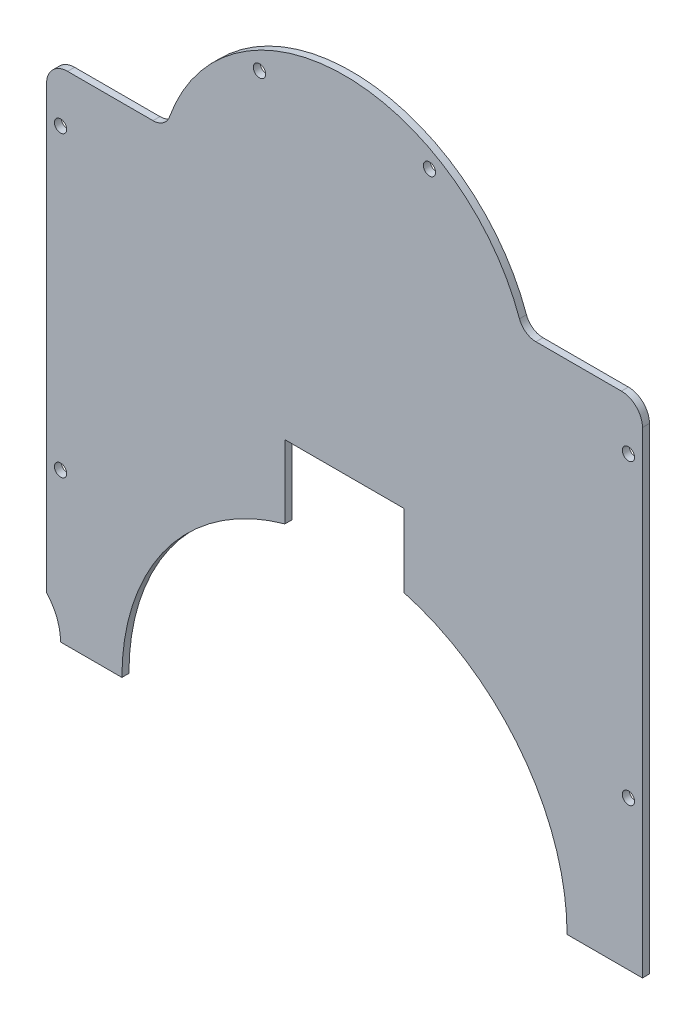
ISO-10303-21;
HEADER;
FILE_DESCRIPTION(('STEP AP214'),'2;1');
FILE_NAME('part.step','',(''),(''),'','','');
FILE_SCHEMA(('AUTOMOTIVE_DESIGN { 1 0 10303 214 1 1 1 1 }'));
ENDSEC;
DATA;
#1=APPLICATION_CONTEXT('core data for automotive mechanical design processes');
#2=APPLICATION_PROTOCOL_DEFINITION('international standard','automotive_design',2000,#1);
#3=PRODUCT_CONTEXT('',#1,'mechanical');
#4=PRODUCT('Part','Part','',(#3));
#5=PRODUCT_RELATED_PRODUCT_CATEGORY('part','',(#4));
#6=PRODUCT_DEFINITION_FORMATION('','',#4);
#7=PRODUCT_DEFINITION_CONTEXT('part definition',#1,'design');
#8=PRODUCT_DEFINITION('design','',#6,#7);
#9=PRODUCT_DEFINITION_SHAPE('','',#8);
#10=(LENGTH_UNIT() NAMED_UNIT(*) SI_UNIT(.MILLI.,.METRE.));
#11=(NAMED_UNIT(*) PLANE_ANGLE_UNIT() SI_UNIT($,.RADIAN.));
#12=(NAMED_UNIT(*) SI_UNIT($,.STERADIAN.) SOLID_ANGLE_UNIT());
#13=UNCERTAINTY_MEASURE_WITH_UNIT(LENGTH_MEASURE(1.E-05),#10,'distance_accuracy_value','');
#14=(GEOMETRIC_REPRESENTATION_CONTEXT(3) GLOBAL_UNCERTAINTY_ASSIGNED_CONTEXT((#13)) GLOBAL_UNIT_ASSIGNED_CONTEXT((#10,
#11,#12)) REPRESENTATION_CONTEXT('',''));
#15=CARTESIAN_POINT('',(0.,0.,0.));
#16=DIRECTION('',(0.,0.,1.));
#17=DIRECTION('',(1.,0.,0.));
#18=AXIS2_PLACEMENT_3D('',#15,#16,#17);
#19=CARTESIAN_POINT('',(0.,127.5,2.));
#20=DIRECTION('',(0.,0.,1.));
#21=DIRECTION('',(1.,0.,0.));
#22=AXIS2_PLACEMENT_3D('',#19,#20,#21);
#23=PLANE('',#22);
#24=CARTESIAN_POINT('',(81.,127.5,2.));
#25=DIRECTION('',(0.,0.,1.));
#26=DIRECTION('',(-1.,0.,0.));
#27=AXIS2_PLACEMENT_3D('',#24,#25,#26);
#28=CIRCLE('',#27,1.75);
#29=CARTESIAN_POINT('',(79.25,127.5,2.));
#30=VERTEX_POINT('',#29);
#31=EDGE_CURVE('E366',#30,#30,#28,.T.);
#32=ORIENTED_EDGE('',*,*,#31,.F.);
#33=EDGE_LOOP('',(#32));
#34=FACE_BOUND('',#33,.T.);
#35=CARTESIAN_POINT('',(-24.2499999999998,169.502232083545,2.));
#36=DIRECTION('',(0.,0.,1.));
#37=DIRECTION('',(1.,0.,0.));
#38=AXIS2_PLACEMENT_3D('',#35,#36,#37);
#39=CIRCLE('',#38,1.75);
#40=CARTESIAN_POINT('',(-22.4999999999997,169.502232083545,2.));
#41=VERTEX_POINT('',#40);
#42=EDGE_CURVE('E378',#41,#41,#39,.T.);
#43=ORIENTED_EDGE('',*,*,#42,.F.);
#44=EDGE_LOOP('',(#43));
#45=FACE_BOUND('',#44,.T.);
#46=CARTESIAN_POINT('',(-81.,42.5,2.));
#47=DIRECTION('',(0.,0.,1.));
#48=DIRECTION('',(1.,0.,0.));
#49=AXIS2_PLACEMENT_3D('',#46,#47,#48);
#50=CIRCLE('',#49,1.75);
#51=CARTESIAN_POINT('',(-79.25,42.5,2.));
#52=VERTEX_POINT('',#51);
#53=EDGE_CURVE('E189',#52,#52,#50,.T.);
#54=ORIENTED_EDGE('',*,*,#53,.F.);
#55=EDGE_LOOP('',(#54));
#56=FACE_BOUND('',#55,.T.);
#57=CARTESIAN_POINT('',(0.,127.5,2.));
#58=DIRECTION('',(0.,0.,1.));
#59=DIRECTION('',(1.,0.,0.));
#60=AXIS2_PLACEMENT_3D('',#57,#58,#59);
#61=CIRCLE('',#60,53.);
#62=CARTESIAN_POINT('',(49.9147720409035,145.318965517241,2.));
#63=VERTEX_POINT('',#62);
#64=CARTESIAN_POINT('',(-49.9147720409035,145.318965517241,2.));
#65=VERTEX_POINT('',#64);
#66=EDGE_CURVE('E218',#63,#65,#61,.T.);
#67=ORIENTED_EDGE('',*,*,#66,.T.);
#68=CARTESIAN_POINT('',(-54.6237127994793,147.,2.));
#69=DIRECTION('',(0.,0.,-1.));
#70=DIRECTION('',(1.,0.,0.));
#71=AXIS2_PLACEMENT_3D('',#68,#69,#70);
#72=CIRCLE('',#71,5.00000000000001);
#73=CARTESIAN_POINT('',(-54.6237127994793,142.,2.));
#74=VERTEX_POINT('',#73);
#75=EDGE_CURVE('E121',#65,#74,#72,.T.);
#76=ORIENTED_EDGE('',*,*,#75,.T.);
#77=DIRECTION('',(-1.,0.,0.));
#78=VECTOR('',#77,1.);
#79=CARTESIAN_POINT('',(-54.6237127994793,142.,2.));
#80=LINE('',#79,#78);
#81=CARTESIAN_POINT('',(-79.,142.,2.));
#82=VERTEX_POINT('',#81);
#83=EDGE_CURVE('E260',#74,#82,#80,.T.);
#84=ORIENTED_EDGE('',*,*,#83,.T.);
#85=CARTESIAN_POINT('',(-79.,136.,2.));
#86=DIRECTION('',(0.,0.,1.));
#87=DIRECTION('',(1.,0.,0.));
#88=AXIS2_PLACEMENT_3D('',#85,#86,#87);
#89=CIRCLE('',#88,5.99999999999998);
#90=CARTESIAN_POINT('',(-85.,136.,2.));
#91=VERTEX_POINT('',#90);
#92=EDGE_CURVE('E279',#82,#91,#89,.T.);
#93=ORIENTED_EDGE('',*,*,#92,.T.);
#94=DIRECTION('',(0.,-1.,0.));
#95=VECTOR('',#94,1.);
#96=CARTESIAN_POINT('',(-85.,136.,2.));
#97=LINE('',#96,#95);
#98=CARTESIAN_POINT('',(-85.,10.1980390271856,2.));
#99=VERTEX_POINT('',#98);
#100=EDGE_CURVE('E276',#91,#99,#97,.T.);
#101=ORIENTED_EDGE('',*,*,#100,.T.);
#102=CARTESIAN_POINT('',(-96.,0.,2.));
#103=DIRECTION('',(0.,0.,-1.));
#104=DIRECTION('',(-1.,0.,0.));
#105=AXIS2_PLACEMENT_3D('',#102,#103,#104);
#106=CIRCLE('',#105,15.);
#107=CARTESIAN_POINT('',(-81.,0.,2.));
#108=VERTEX_POINT('',#107);
#109=EDGE_CURVE('E278',#99,#108,#106,.T.);
#110=ORIENTED_EDGE('',*,*,#109,.T.);
#111=DIRECTION('',(1.,0.,0.));
#112=VECTOR('',#111,1.);
#113=CARTESIAN_POINT('',(-63.5,0.,2.));
#114=LINE('',#113,#112);
#115=CARTESIAN_POINT('',(-63.5,0.,2.));
#116=VERTEX_POINT('',#115);
#117=EDGE_CURVE('E281',#108,#116,#114,.T.);
#118=ORIENTED_EDGE('',*,*,#117,.T.);
#119=CARTESIAN_POINT('',(0.,0.,2.));
#120=DIRECTION('',(0.,0.,-1.));
#121=DIRECTION('',(-1.,0.,0.));
#122=AXIS2_PLACEMENT_3D('',#119,#120,#121);
#123=CIRCLE('',#122,63.5);
#124=CARTESIAN_POINT('',(-17.,61.1821052269371,2.));
#125=VERTEX_POINT('',#124);
#126=EDGE_CURVE('E287',#116,#125,#123,.T.);
#127=ORIENTED_EDGE('',*,*,#126,.T.);
#128=DIRECTION('',(0.,1.,0.));
#129=VECTOR('',#128,1.);
#130=CARTESIAN_POINT('',(-17.,61.1821052269371,2.));
#131=LINE('',#130,#129);
#132=CARTESIAN_POINT('',(-17.,82.,2.));
#133=VERTEX_POINT('',#132);
#134=EDGE_CURVE('E289',#125,#133,#131,.T.);
#135=ORIENTED_EDGE('',*,*,#134,.T.);
#136=DIRECTION('',(1.,0.,0.));
#137=VECTOR('',#136,1.);
#138=CARTESIAN_POINT('',(-17.,82.,2.));
#139=LINE('',#138,#137);
#140=CARTESIAN_POINT('',(17.,82.,2.));
#141=VERTEX_POINT('',#140);
#142=EDGE_CURVE('E291',#133,#141,#139,.T.);
#143=ORIENTED_EDGE('',*,*,#142,.T.);
#144=DIRECTION('',(0.,-1.,0.));
#145=VECTOR('',#144,1.);
#146=CARTESIAN_POINT('',(17.,82.,2.));
#147=LINE('',#146,#145);
#148=CARTESIAN_POINT('',(17.,61.1821052269371,2.));
#149=VERTEX_POINT('',#148);
#150=EDGE_CURVE('E293',#141,#149,#147,.T.);
#151=ORIENTED_EDGE('',*,*,#150,.T.);
#152=CARTESIAN_POINT('',(0.,0.,2.));
#153=DIRECTION('',(0.,0.,-1.));
#154=DIRECTION('',(-1.,0.,0.));
#155=AXIS2_PLACEMENT_3D('',#152,#153,#154);
#156=CIRCLE('',#155,63.5);
#157=CARTESIAN_POINT('',(63.5,0.,2.));
#158=VERTEX_POINT('',#157);
#159=EDGE_CURVE('E295',#149,#158,#156,.T.);
#160=ORIENTED_EDGE('',*,*,#159,.T.);
#161=DIRECTION('',(1.,0.,0.));
#162=VECTOR('',#161,1.);
#163=CARTESIAN_POINT('',(85.,0.,2.));
#164=LINE('',#163,#162);
#165=CARTESIAN_POINT('',(85.,0.,2.));
#166=VERTEX_POINT('',#165);
#167=EDGE_CURVE('E297',#158,#166,#164,.T.);
#168=ORIENTED_EDGE('',*,*,#167,.T.);
#169=DIRECTION('',(0.,1.,0.));
#170=VECTOR('',#169,1.);
#171=CARTESIAN_POINT('',(85.,0.,2.));
#172=LINE('',#171,#170);
#173=CARTESIAN_POINT('',(85.,136.,2.));
#174=VERTEX_POINT('',#173);
#175=EDGE_CURVE('E167',#166,#174,#172,.T.);
#176=ORIENTED_EDGE('',*,*,#175,.T.);
#177=CARTESIAN_POINT('',(79.,136.,2.));
#178=DIRECTION('',(0.,0.,1.));
#179=DIRECTION('',(1.,0.,0.));
#180=AXIS2_PLACEMENT_3D('',#177,#178,#179);
#181=CIRCLE('',#180,6.);
#182=CARTESIAN_POINT('',(79.,142.,2.));
#183=VERTEX_POINT('',#182);
#184=EDGE_CURVE('E161',#174,#183,#181,.T.);
#185=ORIENTED_EDGE('',*,*,#184,.T.);
#186=DIRECTION('',(-1.,0.,0.));
#187=VECTOR('',#186,1.);
#188=CARTESIAN_POINT('',(79.,142.,2.));
#189=LINE('',#188,#187);
#190=CARTESIAN_POINT('',(54.6237127994793,142.,2.));
#191=VERTEX_POINT('',#190);
#192=EDGE_CURVE('E165',#183,#191,#189,.T.);
#193=ORIENTED_EDGE('',*,*,#192,.T.);
#194=CARTESIAN_POINT('',(54.6237127994793,147.,2.));
#195=DIRECTION('',(0.,0.,-1.));
#196=DIRECTION('',(1.,0.,0.));
#197=AXIS2_PLACEMENT_3D('',#194,#195,#196);
#198=CIRCLE('',#197,5.00000000000001);
#199=EDGE_CURVE('E51',#191,#63,#198,.T.);
#200=ORIENTED_EDGE('',*,*,#199,.T.);
#201=EDGE_LOOP('',(#67,#76,#84,#93,#101,#110,#118,#127,#135,#143,#151,#160,#168,#176,#185,#193,#200));
#202=FACE_BOUND('',#201,.T.);
#203=CARTESIAN_POINT('',(-81.,127.5,2.));
#204=DIRECTION('',(0.,0.,1.));
#205=DIRECTION('',(1.,0.,0.));
#206=AXIS2_PLACEMENT_3D('',#203,#204,#205);
#207=CIRCLE('',#206,1.75);
#208=CARTESIAN_POINT('',(-79.25,127.5,2.));
#209=VERTEX_POINT('',#208);
#210=EDGE_CURVE('E384',#209,#209,#207,.T.);
#211=ORIENTED_EDGE('',*,*,#210,.F.);
#212=EDGE_LOOP('',(#211));
#213=FACE_BOUND('',#212,.T.);
#214=CARTESIAN_POINT('',(24.2499999999997,169.502232083545,2.));
#215=DIRECTION('',(0.,0.,1.));
#216=DIRECTION('',(-1.,0.,0.));
#217=AXIS2_PLACEMENT_3D('',#214,#215,#216);
#218=CIRCLE('',#217,1.75);
#219=CARTESIAN_POINT('',(22.4999999999997,169.502232083545,2.));
#220=VERTEX_POINT('',#219);
#221=EDGE_CURVE('E372',#220,#220,#218,.T.);
#222=ORIENTED_EDGE('',*,*,#221,.F.);
#223=EDGE_LOOP('',(#222));
#224=FACE_BOUND('',#223,.T.);
#225=CARTESIAN_POINT('',(81.,42.5,2.));
#226=DIRECTION('',(0.,0.,1.));
#227=DIRECTION('',(-1.,0.,0.));
#228=AXIS2_PLACEMENT_3D('',#225,#226,#227);
#229=CIRCLE('',#228,1.75);
#230=CARTESIAN_POINT('',(79.25,42.5,2.));
#231=VERTEX_POINT('',#230);
#232=EDGE_CURVE('E357',#231,#231,#229,.T.);
#233=ORIENTED_EDGE('',*,*,#232,.F.);
#234=EDGE_LOOP('',(#233));
#235=FACE_BOUND('',#234,.T.);
#236=ADVANCED_FACE('F34',(#34,#45,#56,#202,#213,#224,#235),#23,.T.);
#237=CARTESIAN_POINT('',(0.,127.5,0.));
#238=DIRECTION('',(0.,0.,1.));
#239=DIRECTION('',(1.,0.,0.));
#240=AXIS2_PLACEMENT_3D('',#237,#238,#239);
#241=PLANE('',#240);
#242=CARTESIAN_POINT('',(81.,127.5,0.));
#243=DIRECTION('',(0.,0.,1.));
#244=DIRECTION('',(-1.,0.,0.));
#245=AXIS2_PLACEMENT_3D('',#242,#243,#244);
#246=CIRCLE('',#245,1.75);
#247=CARTESIAN_POINT('',(79.25,127.5,0.));
#248=VERTEX_POINT('',#247);
#249=EDGE_CURVE('E363',#248,#248,#246,.T.);
#250=ORIENTED_EDGE('',*,*,#249,.T.);
#251=EDGE_LOOP('',(#250));
#252=FACE_BOUND('',#251,.T.);
#253=CARTESIAN_POINT('',(-24.2499999999998,169.502232083545,0.));
#254=DIRECTION('',(0.,0.,1.));
#255=DIRECTION('',(1.,0.,0.));
#256=AXIS2_PLACEMENT_3D('',#253,#254,#255);
#257=CIRCLE('',#256,1.75);
#258=CARTESIAN_POINT('',(-22.4999999999997,169.502232083545,0.));
#259=VERTEX_POINT('',#258);
#260=EDGE_CURVE('E375',#259,#259,#257,.T.);
#261=ORIENTED_EDGE('',*,*,#260,.T.);
#262=EDGE_LOOP('',(#261));
#263=FACE_BOUND('',#262,.T.);
#264=CARTESIAN_POINT('',(-81.,42.5,0.));
#265=DIRECTION('',(0.,0.,1.));
#266=DIRECTION('',(1.,0.,0.));
#267=AXIS2_PLACEMENT_3D('',#264,#265,#266);
#268=CIRCLE('',#267,1.75);
#269=CARTESIAN_POINT('',(-79.25,42.5,0.));
#270=VERTEX_POINT('',#269);
#271=EDGE_CURVE('E387',#270,#270,#268,.T.);
#272=ORIENTED_EDGE('',*,*,#271,.T.);
#273=EDGE_LOOP('',(#272));
#274=FACE_BOUND('',#273,.T.);
#275=CARTESIAN_POINT('',(0.,127.5,0.));
#276=DIRECTION('',(0.,0.,1.));
#277=DIRECTION('',(1.,0.,0.));
#278=AXIS2_PLACEMENT_3D('',#275,#276,#277);
#279=CIRCLE('',#278,53.);
#280=CARTESIAN_POINT('',(49.9147720409035,145.318965517241,0.));
#281=VERTEX_POINT('',#280);
#282=CARTESIAN_POINT('',(-49.9147720409035,145.318965517241,0.));
#283=VERTEX_POINT('',#282);
#284=EDGE_CURVE('E185',#281,#283,#279,.T.);
#285=ORIENTED_EDGE('',*,*,#284,.F.);
#286=CARTESIAN_POINT('',(54.6237127994793,147.,0.));
#287=DIRECTION('',(0.,0.,-1.));
#288=DIRECTION('',(1.,0.,0.));
#289=AXIS2_PLACEMENT_3D('',#286,#287,#288);
#290=CIRCLE('',#289,5.00000000000001);
#291=CARTESIAN_POINT('',(54.6237127994793,142.,0.));
#292=VERTEX_POINT('',#291);
#293=EDGE_CURVE('E113',#292,#281,#290,.T.);
#294=ORIENTED_EDGE('',*,*,#293,.F.);
#295=DIRECTION('',(-1.,0.,0.));
#296=VECTOR('',#295,1.);
#297=CARTESIAN_POINT('',(79.,142.,0.));
#298=LINE('',#297,#296);
#299=CARTESIAN_POINT('',(79.,142.,0.));
#300=VERTEX_POINT('',#299);
#301=EDGE_CURVE('E107',#300,#292,#298,.T.);
#302=ORIENTED_EDGE('',*,*,#301,.F.);
#303=CARTESIAN_POINT('',(79.,136.,0.));
#304=DIRECTION('',(0.,0.,1.));
#305=DIRECTION('',(1.,0.,0.));
#306=AXIS2_PLACEMENT_3D('',#303,#304,#305);
#307=CIRCLE('',#306,6.);
#308=CARTESIAN_POINT('',(85.,136.,0.));
#309=VERTEX_POINT('',#308);
#310=EDGE_CURVE('E175',#309,#300,#307,.T.);
#311=ORIENTED_EDGE('',*,*,#310,.F.);
#312=DIRECTION('',(0.,1.,0.));
#313=VECTOR('',#312,1.);
#314=CARTESIAN_POINT('',(85.,0.,0.));
#315=LINE('',#314,#313);
#316=CARTESIAN_POINT('',(85.,0.,0.));
#317=VERTEX_POINT('',#316);
#318=EDGE_CURVE('E213',#317,#309,#315,.T.);
#319=ORIENTED_EDGE('',*,*,#318,.F.);
#320=DIRECTION('',(1.,0.,0.));
#321=VECTOR('',#320,1.);
#322=CARTESIAN_POINT('',(85.,0.,0.));
#323=LINE('',#322,#321);
#324=CARTESIAN_POINT('',(63.5,0.,0.));
#325=VERTEX_POINT('',#324);
#326=EDGE_CURVE('E211',#325,#317,#323,.T.);
#327=ORIENTED_EDGE('',*,*,#326,.F.);
#328=CARTESIAN_POINT('',(0.,0.,0.));
#329=DIRECTION('',(0.,0.,-1.));
#330=DIRECTION('',(-1.,0.,0.));
#331=AXIS2_PLACEMENT_3D('',#328,#329,#330);
#332=CIRCLE('',#331,63.5);
#333=CARTESIAN_POINT('',(17.,61.1821052269371,0.));
#334=VERTEX_POINT('',#333);
#335=EDGE_CURVE('E209',#334,#325,#332,.T.);
#336=ORIENTED_EDGE('',*,*,#335,.F.);
#337=DIRECTION('',(0.,-1.,0.));
#338=VECTOR('',#337,1.);
#339=CARTESIAN_POINT('',(17.,82.,0.));
#340=LINE('',#339,#338);
#341=CARTESIAN_POINT('',(17.,82.,0.));
#342=VERTEX_POINT('',#341);
#343=EDGE_CURVE('E207',#342,#334,#340,.T.);
#344=ORIENTED_EDGE('',*,*,#343,.F.);
#345=DIRECTION('',(1.,0.,0.));
#346=VECTOR('',#345,1.);
#347=CARTESIAN_POINT('',(-17.,82.,0.));
#348=LINE('',#347,#346);
#349=CARTESIAN_POINT('',(-17.,82.,0.));
#350=VERTEX_POINT('',#349);
#351=EDGE_CURVE('E205',#350,#342,#348,.T.);
#352=ORIENTED_EDGE('',*,*,#351,.F.);
#353=DIRECTION('',(0.,1.,0.));
#354=VECTOR('',#353,1.);
#355=CARTESIAN_POINT('',(-17.,61.1821052269371,0.));
#356=LINE('',#355,#354);
#357=CARTESIAN_POINT('',(-17.,61.1821052269371,0.));
#358=VERTEX_POINT('',#357);
#359=EDGE_CURVE('E203',#358,#350,#356,.T.);
#360=ORIENTED_EDGE('',*,*,#359,.F.);
#361=CARTESIAN_POINT('',(0.,0.,0.));
#362=DIRECTION('',(0.,0.,-1.));
#363=DIRECTION('',(-1.,0.,0.));
#364=AXIS2_PLACEMENT_3D('',#361,#362,#363);
#365=CIRCLE('',#364,63.5);
#366=CARTESIAN_POINT('',(-63.5,0.,0.));
#367=VERTEX_POINT('',#366);
#368=EDGE_CURVE('E201',#367,#358,#365,.T.);
#369=ORIENTED_EDGE('',*,*,#368,.F.);
#370=DIRECTION('',(1.,0.,0.));
#371=VECTOR('',#370,1.);
#372=CARTESIAN_POINT('',(-63.5,0.,0.));
#373=LINE('',#372,#371);
#374=CARTESIAN_POINT('',(-81.,0.,0.));
#375=VERTEX_POINT('',#374);
#376=EDGE_CURVE('E199',#375,#367,#373,.T.);
#377=ORIENTED_EDGE('',*,*,#376,.F.);
#378=CARTESIAN_POINT('',(-96.,0.,0.));
#379=DIRECTION('',(0.,0.,-1.));
#380=DIRECTION('',(-1.,0.,0.));
#381=AXIS2_PLACEMENT_3D('',#378,#379,#380);
#382=CIRCLE('',#381,15.);
#383=CARTESIAN_POINT('',(-85.,10.1980390271856,0.));
#384=VERTEX_POINT('',#383);
#385=EDGE_CURVE('E197',#384,#375,#382,.T.);
#386=ORIENTED_EDGE('',*,*,#385,.F.);
#387=DIRECTION('',(0.,-1.,0.));
#388=VECTOR('',#387,1.);
#389=CARTESIAN_POINT('',(-85.,136.,0.));
#390=LINE('',#389,#388);
#391=CARTESIAN_POINT('',(-85.,136.,0.));
#392=VERTEX_POINT('',#391);
#393=EDGE_CURVE('E195',#392,#384,#390,.T.);
#394=ORIENTED_EDGE('',*,*,#393,.F.);
#395=CARTESIAN_POINT('',(-79.,136.,0.));
#396=DIRECTION('',(0.,0.,1.));
#397=DIRECTION('',(1.,0.,0.));
#398=AXIS2_PLACEMENT_3D('',#395,#396,#397);
#399=CIRCLE('',#398,5.99999999999998);
#400=CARTESIAN_POINT('',(-79.,142.,0.));
#401=VERTEX_POINT('',#400);
#402=EDGE_CURVE('E193',#401,#392,#399,.T.);
#403=ORIENTED_EDGE('',*,*,#402,.F.);
#404=DIRECTION('',(-1.,0.,0.));
#405=VECTOR('',#404,1.);
#406=CARTESIAN_POINT('',(-54.6237127994793,142.,0.));
#407=LINE('',#406,#405);
#408=CARTESIAN_POINT('',(-54.6237127994793,142.,0.));
#409=VERTEX_POINT('',#408);
#410=EDGE_CURVE('E191',#409,#401,#407,.T.);
#411=ORIENTED_EDGE('',*,*,#410,.F.);
#412=CARTESIAN_POINT('',(-54.6237127994793,147.,0.));
#413=DIRECTION('',(0.,0.,-1.));
#414=DIRECTION('',(1.,0.,0.));
#415=AXIS2_PLACEMENT_3D('',#412,#413,#414);
#416=CIRCLE('',#415,5.00000000000001);
#417=EDGE_CURVE('E188',#283,#409,#416,.T.);
#418=ORIENTED_EDGE('',*,*,#417,.F.);
#419=EDGE_LOOP('',(#285,#294,#302,#311,#319,#327,#336,#344,#352,#360,#369,#377,#386,#394,#403,
#411,#418));
#420=FACE_BOUND('',#419,.T.);
#421=CARTESIAN_POINT('',(-81.,127.5,0.));
#422=DIRECTION('',(0.,0.,1.));
#423=DIRECTION('',(1.,0.,0.));
#424=AXIS2_PLACEMENT_3D('',#421,#422,#423);
#425=CIRCLE('',#424,1.75);
#426=CARTESIAN_POINT('',(-79.25,127.5,0.));
#427=VERTEX_POINT('',#426);
#428=EDGE_CURVE('E381',#427,#427,#425,.T.);
#429=ORIENTED_EDGE('',*,*,#428,.T.);
#430=EDGE_LOOP('',(#429));
#431=FACE_BOUND('',#430,.T.);
#432=CARTESIAN_POINT('',(24.2499999999997,169.502232083545,0.));
#433=DIRECTION('',(0.,0.,1.));
#434=DIRECTION('',(-1.,0.,0.));
#435=AXIS2_PLACEMENT_3D('',#432,#433,#434);
#436=CIRCLE('',#435,1.75);
#437=CARTESIAN_POINT('',(22.4999999999997,169.502232083545,0.));
#438=VERTEX_POINT('',#437);
#439=EDGE_CURVE('E369',#438,#438,#436,.T.);
#440=ORIENTED_EDGE('',*,*,#439,.T.);
#441=EDGE_LOOP('',(#440));
#442=FACE_BOUND('',#441,.T.);
#443=CARTESIAN_POINT('',(81.,42.5,0.));
#444=DIRECTION('',(0.,0.,1.));
#445=DIRECTION('',(-1.,0.,0.));
#446=AXIS2_PLACEMENT_3D('',#443,#444,#445);
#447=CIRCLE('',#446,1.75);
#448=CARTESIAN_POINT('',(79.25,42.5,0.));
#449=VERTEX_POINT('',#448);
#450=EDGE_CURVE('E360',#449,#449,#447,.T.);
#451=ORIENTED_EDGE('',*,*,#450,.T.);
#452=EDGE_LOOP('',(#451));
#453=FACE_BOUND('',#452,.T.);
#454=ADVANCED_FACE('F264',(#252,#263,#274,#420,#431,#442,#453),#241,.F.);
#455=CARTESIAN_POINT('',(0.,127.5,2.));
#456=DIRECTION('',(0.,0.,-1.));
#457=DIRECTION('',(-1.,0.,0.));
#458=AXIS2_PLACEMENT_3D('',#455,#456,#457);
#459=CYLINDRICAL_SURFACE('',#458,53.);
#460=ORIENTED_EDGE('',*,*,#284,.T.);
#461=DIRECTION('',(0.,0.,-1.));
#462=VECTOR('',#461,1.);
#463=CARTESIAN_POINT('',(-49.9147720409035,145.318965517241,2.));
#464=LINE('',#463,#462);
#465=EDGE_CURVE('E11',#65,#283,#464,.T.);
#466=ORIENTED_EDGE('',*,*,#465,.F.);
#467=ORIENTED_EDGE('',*,*,#66,.F.);
#468=DIRECTION('',(0.,0.,-1.));
#469=VECTOR('',#468,1.);
#470=CARTESIAN_POINT('',(49.9147720409035,145.318965517241,2.));
#471=LINE('',#470,#469);
#472=EDGE_CURVE('E181',#63,#281,#471,.T.);
#473=ORIENTED_EDGE('',*,*,#472,.T.);
#474=EDGE_LOOP('',(#460,#466,#467,#473));
#475=FACE_BOUND('',#474,.T.);
#476=ADVANCED_FACE('F36',(#475),#459,.T.);
#477=CARTESIAN_POINT('',(-54.6237127994793,147.,2.));
#478=DIRECTION('',(0.,0.,-1.));
#479=DIRECTION('',(-1.,0.,0.));
#480=AXIS2_PLACEMENT_3D('',#477,#478,#479);
#481=CYLINDRICAL_SURFACE('',#480,5.00000000000001);
#482=ORIENTED_EDGE('',*,*,#417,.T.);
#483=DIRECTION('',(0.,0.,-1.));
#484=VECTOR('',#483,1.);
#485=CARTESIAN_POINT('',(-54.6237127994793,142.,2.));
#486=LINE('',#485,#484);
#487=EDGE_CURVE('E43',#74,#409,#486,.T.);
#488=ORIENTED_EDGE('',*,*,#487,.F.);
#489=ORIENTED_EDGE('',*,*,#75,.F.);
#490=ORIENTED_EDGE('',*,*,#465,.T.);
#491=EDGE_LOOP('',(#482,#488,#489,#490));
#492=FACE_BOUND('',#491,.T.);
#493=ADVANCED_FACE('F564',(#492),#481,.F.);
#494=CARTESIAN_POINT('',(-54.6237127994793,142.,2.));
#495=DIRECTION('',(0.,-1.,0.));
#496=DIRECTION('',(1.,0.,0.));
#497=AXIS2_PLACEMENT_3D('',#494,#495,#496);
#498=PLANE('',#497);
#499=ORIENTED_EDGE('',*,*,#410,.T.);
#500=DIRECTION('',(0.,0.,-1.));
#501=VECTOR('',#500,1.);
#502=CARTESIAN_POINT('',(-79.,142.,2.));
#503=LINE('',#502,#501);
#504=EDGE_CURVE('E252',#82,#401,#503,.T.);
#505=ORIENTED_EDGE('',*,*,#504,.F.);
#506=ORIENTED_EDGE('',*,*,#83,.F.);
#507=ORIENTED_EDGE('',*,*,#487,.T.);
#508=EDGE_LOOP('',(#499,#505,#506,#507));
#509=FACE_BOUND('',#508,.T.);
#510=ADVANCED_FACE('F258',(#509),#498,.F.);
#511=CARTESIAN_POINT('',(-79.,136.,2.));
#512=DIRECTION('',(0.,0.,-1.));
#513=DIRECTION('',(-1.,0.,0.));
#514=AXIS2_PLACEMENT_3D('',#511,#512,#513);
#515=CYLINDRICAL_SURFACE('',#514,5.99999999999998);
#516=ORIENTED_EDGE('',*,*,#402,.T.);
#517=DIRECTION('',(0.,0.,-1.));
#518=VECTOR('',#517,1.);
#519=CARTESIAN_POINT('',(-85.,136.,2.));
#520=LINE('',#519,#518);
#521=EDGE_CURVE('E249',#91,#392,#520,.T.);
#522=ORIENTED_EDGE('',*,*,#521,.F.);
#523=ORIENTED_EDGE('',*,*,#92,.F.);
#524=ORIENTED_EDGE('',*,*,#504,.T.);
#525=EDGE_LOOP('',(#516,#522,#523,#524));
#526=FACE_BOUND('',#525,.T.);
#527=ADVANCED_FACE('F270',(#526),#515,.T.);
#528=CARTESIAN_POINT('',(-85.,136.,2.));
#529=DIRECTION('',(1.,0.,0.));
#530=DIRECTION('',(0.,0.,-1.));
#531=AXIS2_PLACEMENT_3D('',#528,#529,#530);
#532=PLANE('',#531);
#533=ORIENTED_EDGE('',*,*,#393,.T.);
#534=DIRECTION('',(0.,0.,-1.));
#535=VECTOR('',#534,1.);
#536=CARTESIAN_POINT('',(-85.,10.1980390271856,2.));
#537=LINE('',#536,#535);
#538=EDGE_CURVE('E246',#99,#384,#537,.T.);
#539=ORIENTED_EDGE('',*,*,#538,.F.);
#540=ORIENTED_EDGE('',*,*,#100,.F.);
#541=ORIENTED_EDGE('',*,*,#521,.T.);
#542=EDGE_LOOP('',(#533,#539,#540,#541));
#543=FACE_BOUND('',#542,.T.);
#544=ADVANCED_FACE('F274',(#543),#532,.F.);
#545=CARTESIAN_POINT('',(-96.,0.,2.));
#546=DIRECTION('',(0.,0.,-1.));
#547=DIRECTION('',(-1.,0.,0.));
#548=AXIS2_PLACEMENT_3D('',#545,#546,#547);
#549=CYLINDRICAL_SURFACE('',#548,15.);
#550=ORIENTED_EDGE('',*,*,#385,.T.);
#551=DIRECTION('',(0.,0.,-1.));
#552=VECTOR('',#551,1.);
#553=CARTESIAN_POINT('',(-81.,0.,2.));
#554=LINE('',#553,#552);
#555=EDGE_CURVE('E243',#108,#375,#554,.T.);
#556=ORIENTED_EDGE('',*,*,#555,.F.);
#557=ORIENTED_EDGE('',*,*,#109,.F.);
#558=ORIENTED_EDGE('',*,*,#538,.T.);
#559=EDGE_LOOP('',(#550,#556,#557,#558));
#560=FACE_BOUND('',#559,.T.);
#561=ADVANCED_FACE('F529',(#560),#549,.F.);
#562=CARTESIAN_POINT('',(-63.5,0.,2.));
#563=DIRECTION('',(0.,1.,0.));
#564=DIRECTION('',(-1.,0.,0.));
#565=AXIS2_PLACEMENT_3D('',#562,#563,#564);
#566=PLANE('',#565);
#567=ORIENTED_EDGE('',*,*,#376,.T.);
#568=DIRECTION('',(0.,0.,-1.));
#569=VECTOR('',#568,1.);
#570=CARTESIAN_POINT('',(-63.5,0.,2.));
#571=LINE('',#570,#569);
#572=EDGE_CURVE('E240',#116,#367,#571,.T.);
#573=ORIENTED_EDGE('',*,*,#572,.F.);
#574=ORIENTED_EDGE('',*,*,#117,.F.);
#575=ORIENTED_EDGE('',*,*,#555,.T.);
#576=EDGE_LOOP('',(#567,#573,#574,#575));
#577=FACE_BOUND('',#576,.T.);
#578=ADVANCED_FACE('F519',(#577),#566,.F.);
#579=CARTESIAN_POINT('',(0.,0.,2.));
#580=DIRECTION('',(0.,0.,-1.));
#581=DIRECTION('',(-1.,0.,0.));
#582=AXIS2_PLACEMENT_3D('',#579,#580,#581);
#583=CYLINDRICAL_SURFACE('',#582,63.5);
#584=ORIENTED_EDGE('',*,*,#368,.T.);
#585=DIRECTION('',(0.,0.,-1.));
#586=VECTOR('',#585,1.);
#587=CARTESIAN_POINT('',(-17.,61.1821052269371,2.));
#588=LINE('',#587,#586);
#589=EDGE_CURVE('E237',#125,#358,#588,.T.);
#590=ORIENTED_EDGE('',*,*,#589,.F.);
#591=ORIENTED_EDGE('',*,*,#126,.F.);
#592=ORIENTED_EDGE('',*,*,#572,.T.);
#593=EDGE_LOOP('',(#584,#590,#591,#592));
#594=FACE_BOUND('',#593,.T.);
#595=ADVANCED_FACE('F509',(#594),#583,.F.);
#596=CARTESIAN_POINT('',(-17.,61.1821052269371,2.));
#597=DIRECTION('',(-1.,0.,0.));
#598=DIRECTION('',(0.,0.,1.));
#599=AXIS2_PLACEMENT_3D('',#596,#597,#598);
#600=PLANE('',#599);
#601=ORIENTED_EDGE('',*,*,#359,.T.);
#602=DIRECTION('',(0.,0.,-1.));
#603=VECTOR('',#602,1.);
#604=CARTESIAN_POINT('',(-17.,82.,2.));
#605=LINE('',#604,#603);
#606=EDGE_CURVE('E234',#133,#350,#605,.T.);
#607=ORIENTED_EDGE('',*,*,#606,.F.);
#608=ORIENTED_EDGE('',*,*,#134,.F.);
#609=ORIENTED_EDGE('',*,*,#589,.T.);
#610=EDGE_LOOP('',(#601,#607,#608,#609));
#611=FACE_BOUND('',#610,.T.);
#612=ADVANCED_FACE('F499',(#611),#600,.F.);
#613=CARTESIAN_POINT('',(-17.,82.,2.));
#614=DIRECTION('',(0.,1.,0.));
#615=DIRECTION('',(0.,0.,1.));
#616=AXIS2_PLACEMENT_3D('',#613,#614,#615);
#617=PLANE('',#616);
#618=ORIENTED_EDGE('',*,*,#351,.T.);
#619=DIRECTION('',(0.,0.,-1.));
#620=VECTOR('',#619,1.);
#621=CARTESIAN_POINT('',(17.,82.,2.));
#622=LINE('',#621,#620);
#623=EDGE_CURVE('E231',#141,#342,#622,.T.);
#624=ORIENTED_EDGE('',*,*,#623,.F.);
#625=ORIENTED_EDGE('',*,*,#142,.F.);
#626=ORIENTED_EDGE('',*,*,#606,.T.);
#627=EDGE_LOOP('',(#618,#624,#625,#626));
#628=FACE_BOUND('',#627,.T.);
#629=ADVANCED_FACE('F489',(#628),#617,.F.);
#630=CARTESIAN_POINT('',(17.,82.,2.));
#631=DIRECTION('',(1.,0.,0.));
#632=DIRECTION('',(0.,1.,0.));
#633=AXIS2_PLACEMENT_3D('',#630,#631,#632);
#634=PLANE('',#633);
#635=ORIENTED_EDGE('',*,*,#343,.T.);
#636=DIRECTION('',(0.,0.,-1.));
#637=VECTOR('',#636,1.);
#638=CARTESIAN_POINT('',(17.,61.1821052269371,2.));
#639=LINE('',#638,#637);
#640=EDGE_CURVE('E228',#149,#334,#639,.T.);
#641=ORIENTED_EDGE('',*,*,#640,.F.);
#642=ORIENTED_EDGE('',*,*,#150,.F.);
#643=ORIENTED_EDGE('',*,*,#623,.T.);
#644=EDGE_LOOP('',(#635,#641,#642,#643));
#645=FACE_BOUND('',#644,.T.);
#646=ADVANCED_FACE('F479',(#645),#634,.F.);
#647=CARTESIAN_POINT('',(0.,0.,2.));
#648=DIRECTION('',(0.,0.,-1.));
#649=DIRECTION('',(-1.,0.,0.));
#650=AXIS2_PLACEMENT_3D('',#647,#648,#649);
#651=CYLINDRICAL_SURFACE('',#650,63.5);
#652=ORIENTED_EDGE('',*,*,#335,.T.);
#653=DIRECTION('',(0.,0.,-1.));
#654=VECTOR('',#653,1.);
#655=CARTESIAN_POINT('',(63.5,0.,2.));
#656=LINE('',#655,#654);
#657=EDGE_CURVE('E225',#158,#325,#656,.T.);
#658=ORIENTED_EDGE('',*,*,#657,.F.);
#659=ORIENTED_EDGE('',*,*,#159,.F.);
#660=ORIENTED_EDGE('',*,*,#640,.T.);
#661=EDGE_LOOP('',(#652,#658,#659,#660));
#662=FACE_BOUND('',#661,.T.);
#663=ADVANCED_FACE('F470',(#662),#651,.F.);
#664=CARTESIAN_POINT('',(85.,0.,2.));
#665=DIRECTION('',(0.,1.,0.));
#666=DIRECTION('',(0.,0.,1.));
#667=AXIS2_PLACEMENT_3D('',#664,#665,#666);
#668=PLANE('',#667);
#669=ORIENTED_EDGE('',*,*,#326,.T.);
#670=DIRECTION('',(0.,0.,-1.));
#671=VECTOR('',#670,1.);
#672=CARTESIAN_POINT('',(85.,0.,2.));
#673=LINE('',#672,#671);
#674=EDGE_CURVE('E222',#166,#317,#673,.T.);
#675=ORIENTED_EDGE('',*,*,#674,.F.);
#676=ORIENTED_EDGE('',*,*,#167,.F.);
#677=ORIENTED_EDGE('',*,*,#657,.T.);
#678=EDGE_LOOP('',(#669,#675,#676,#677));
#679=FACE_BOUND('',#678,.T.);
#680=ADVANCED_FACE('F303',(#679),#668,.F.);
#681=CARTESIAN_POINT('',(85.,0.,2.));
#682=DIRECTION('',(-1.,0.,0.));
#683=DIRECTION('',(0.,-1.,0.));
#684=AXIS2_PLACEMENT_3D('',#681,#682,#683);
#685=PLANE('',#684);
#686=ORIENTED_EDGE('',*,*,#318,.T.);
#687=DIRECTION('',(0.,0.,-1.));
#688=VECTOR('',#687,1.);
#689=CARTESIAN_POINT('',(85.,136.,2.));
#690=LINE('',#689,#688);
#691=EDGE_CURVE('E176',#174,#309,#690,.T.);
#692=ORIENTED_EDGE('',*,*,#691,.F.);
#693=ORIENTED_EDGE('',*,*,#175,.F.);
#694=ORIENTED_EDGE('',*,*,#674,.T.);
#695=EDGE_LOOP('',(#686,#692,#693,#694));
#696=FACE_BOUND('',#695,.T.);
#697=ADVANCED_FACE('F307',(#696),#685,.F.);
#698=CARTESIAN_POINT('',(79.,136.,2.));
#699=DIRECTION('',(0.,0.,-1.));
#700=DIRECTION('',(-1.,0.,0.));
#701=AXIS2_PLACEMENT_3D('',#698,#699,#700);
#702=CYLINDRICAL_SURFACE('',#701,6.);
#703=ORIENTED_EDGE('',*,*,#310,.T.);
#704=DIRECTION('',(0.,0.,-1.));
#705=VECTOR('',#704,1.);
#706=CARTESIAN_POINT('',(79.,142.,2.));
#707=LINE('',#706,#705);
#708=EDGE_CURVE('E172',#183,#300,#707,.T.);
#709=ORIENTED_EDGE('',*,*,#708,.F.);
#710=ORIENTED_EDGE('',*,*,#184,.F.);
#711=ORIENTED_EDGE('',*,*,#691,.T.);
#712=EDGE_LOOP('',(#703,#709,#710,#711));
#713=FACE_BOUND('',#712,.T.);
#714=ADVANCED_FACE('F173',(#713),#702,.T.);
#715=CARTESIAN_POINT('',(79.,142.,2.));
#716=DIRECTION('',(0.,-1.,0.));
#717=DIRECTION('',(0.,0.,-1.));
#718=AXIS2_PLACEMENT_3D('',#715,#716,#717);
#719=PLANE('',#718);
#720=ORIENTED_EDGE('',*,*,#301,.T.);
#721=DIRECTION('',(0.,0.,-1.));
#722=VECTOR('',#721,1.);
#723=CARTESIAN_POINT('',(54.6237127994793,142.,2.));
#724=LINE('',#723,#722);
#725=EDGE_CURVE('E177',#191,#292,#724,.T.);
#726=ORIENTED_EDGE('',*,*,#725,.F.);
#727=ORIENTED_EDGE('',*,*,#192,.F.);
#728=ORIENTED_EDGE('',*,*,#708,.T.);
#729=EDGE_LOOP('',(#720,#726,#727,#728));
#730=FACE_BOUND('',#729,.T.);
#731=ADVANCED_FACE('F179',(#730),#719,.F.);
#732=CARTESIAN_POINT('',(54.6237127994793,147.,2.));
#733=DIRECTION('',(0.,0.,-1.));
#734=DIRECTION('',(-1.,0.,0.));
#735=AXIS2_PLACEMENT_3D('',#732,#733,#734);
#736=CYLINDRICAL_SURFACE('',#735,5.00000000000001);
#737=ORIENTED_EDGE('',*,*,#293,.T.);
#738=ORIENTED_EDGE('',*,*,#472,.F.);
#739=ORIENTED_EDGE('',*,*,#199,.F.);
#740=ORIENTED_EDGE('',*,*,#725,.T.);
#741=EDGE_LOOP('',(#737,#738,#739,#740));
#742=FACE_BOUND('',#741,.T.);
#743=ADVANCED_FACE('F311',(#742),#736,.F.);
#744=CARTESIAN_POINT('',(-81.,42.5,2.));
#745=DIRECTION('',(0.,0.,-1.));
#746=DIRECTION('',(-1.,0.,0.));
#747=AXIS2_PLACEMENT_3D('',#744,#745,#746);
#748=CYLINDRICAL_SURFACE('',#747,1.75);
#749=ORIENTED_EDGE('',*,*,#53,.T.);
#750=EDGE_LOOP('',(#749));
#751=FACE_BOUND('',#750,.T.);
#752=ORIENTED_EDGE('',*,*,#271,.F.);
#753=EDGE_LOOP('',(#752));
#754=FACE_BOUND('',#753,.T.);
#755=ADVANCED_FACE('F313',(#751,#754),#748,.F.);
#756=CARTESIAN_POINT('',(-81.,127.5,2.));
#757=DIRECTION('',(0.,0.,-1.));
#758=DIRECTION('',(-1.,0.,0.));
#759=AXIS2_PLACEMENT_3D('',#756,#757,#758);
#760=CYLINDRICAL_SURFACE('',#759,1.75);
#761=ORIENTED_EDGE('',*,*,#210,.T.);
#762=EDGE_LOOP('',(#761));
#763=FACE_BOUND('',#762,.T.);
#764=ORIENTED_EDGE('',*,*,#428,.F.);
#765=EDGE_LOOP('',(#764));
#766=FACE_BOUND('',#765,.T.);
#767=ADVANCED_FACE('F319',(#763,#766),#760,.F.);
#768=CARTESIAN_POINT('',(-24.2499999999998,169.502232083545,2.));
#769=DIRECTION('',(0.,0.,-1.));
#770=DIRECTION('',(-1.,0.,0.));
#771=AXIS2_PLACEMENT_3D('',#768,#769,#770);
#772=CYLINDRICAL_SURFACE('',#771,1.75);
#773=ORIENTED_EDGE('',*,*,#42,.T.);
#774=EDGE_LOOP('',(#773));
#775=FACE_BOUND('',#774,.T.);
#776=ORIENTED_EDGE('',*,*,#260,.F.);
#777=EDGE_LOOP('',(#776));
#778=FACE_BOUND('',#777,.T.);
#779=ADVANCED_FACE('F336',(#775,#778),#772,.F.);
#780=CARTESIAN_POINT('',(24.2499999999997,169.502232083545,2.));
#781=DIRECTION('',(0.,0.,-1.));
#782=DIRECTION('',(-1.,0.,0.));
#783=AXIS2_PLACEMENT_3D('',#780,#781,#782);
#784=CYLINDRICAL_SURFACE('',#783,1.75);
#785=ORIENTED_EDGE('',*,*,#221,.T.);
#786=EDGE_LOOP('',(#785));
#787=FACE_BOUND('',#786,.T.);
#788=ORIENTED_EDGE('',*,*,#439,.F.);
#789=EDGE_LOOP('',(#788));
#790=FACE_BOUND('',#789,.T.);
#791=ADVANCED_FACE('F340',(#787,#790),#784,.F.);
#792=CARTESIAN_POINT('',(81.,127.5,2.));
#793=DIRECTION('',(0.,0.,-1.));
#794=DIRECTION('',(-1.,0.,0.));
#795=AXIS2_PLACEMENT_3D('',#792,#793,#794);
#796=CYLINDRICAL_SURFACE('',#795,1.75);
#797=ORIENTED_EDGE('',*,*,#31,.T.);
#798=EDGE_LOOP('',(#797));
#799=FACE_BOUND('',#798,.T.);
#800=ORIENTED_EDGE('',*,*,#249,.F.);
#801=EDGE_LOOP('',(#800));
#802=FACE_BOUND('',#801,.T.);
#803=ADVANCED_FACE('F344',(#799,#802),#796,.F.);
#804=CARTESIAN_POINT('',(81.,42.5,2.));
#805=DIRECTION('',(0.,0.,-1.));
#806=DIRECTION('',(-1.,0.,0.));
#807=AXIS2_PLACEMENT_3D('',#804,#805,#806);
#808=CYLINDRICAL_SURFACE('',#807,1.75);
#809=ORIENTED_EDGE('',*,*,#232,.T.);
#810=EDGE_LOOP('',(#809));
#811=FACE_BOUND('',#810,.T.);
#812=ORIENTED_EDGE('',*,*,#450,.F.);
#813=EDGE_LOOP('',(#812));
#814=FACE_BOUND('',#813,.T.);
#815=ADVANCED_FACE('F348',(#811,#814),#808,.F.);
#816=CLOSED_SHELL('',(#236,#454,#476,#493,#510,#527,#544,#561,#578,#595,#612,#629,#646,#663,
#680,#697,#714,#731,#743,#755,#767,#779,#791,#803,#815));
#817=MANIFOLD_SOLID_BREP('B2',#816);
#818=ADVANCED_BREP_SHAPE_REPRESENTATION('',(#18,#817),#14);
#819=SHAPE_DEFINITION_REPRESENTATION(#9,#818);
ENDSEC;
END-ISO-10303-21;
